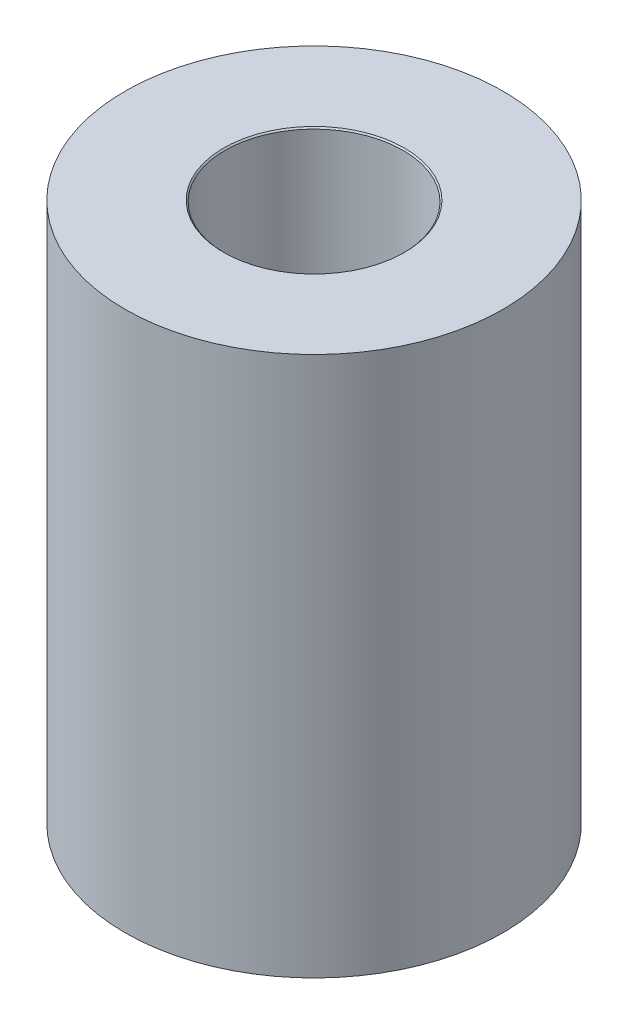
ISO-10303-21;
HEADER;
FILE_DESCRIPTION(('STEP AP214'),'2;1');
FILE_NAME('part.step','',(''),(''),'','','');
FILE_SCHEMA(('AUTOMOTIVE_DESIGN { 1 0 10303 214 1 1 1 1 }'));
ENDSEC;
DATA;
#1=APPLICATION_CONTEXT('core data for automotive mechanical design processes');
#2=APPLICATION_PROTOCOL_DEFINITION('international standard','automotive_design',2000,#1);
#3=PRODUCT_CONTEXT('',#1,'mechanical');
#4=PRODUCT('Part','Part','',(#3));
#5=PRODUCT_RELATED_PRODUCT_CATEGORY('part','',(#4));
#6=PRODUCT_DEFINITION_FORMATION('','',#4);
#7=PRODUCT_DEFINITION_CONTEXT('part definition',#1,'design');
#8=PRODUCT_DEFINITION('design','',#6,#7);
#9=PRODUCT_DEFINITION_SHAPE('','',#8);
#10=(LENGTH_UNIT() NAMED_UNIT(*) SI_UNIT(.MILLI.,.METRE.));
#11=(NAMED_UNIT(*) PLANE_ANGLE_UNIT() SI_UNIT($,.RADIAN.));
#12=(NAMED_UNIT(*) SI_UNIT($,.STERADIAN.) SOLID_ANGLE_UNIT());
#13=UNCERTAINTY_MEASURE_WITH_UNIT(LENGTH_MEASURE(1.E-05),#10,'distance_accuracy_value','');
#14=(GEOMETRIC_REPRESENTATION_CONTEXT(3) GLOBAL_UNCERTAINTY_ASSIGNED_CONTEXT((#13)) GLOBAL_UNIT_ASSIGNED_CONTEXT((#10,
#11,#12)) REPRESENTATION_CONTEXT('',''));
#15=CARTESIAN_POINT('',(0.,0.,0.));
#16=DIRECTION('',(0.,0.,1.));
#17=DIRECTION('',(1.,0.,0.));
#18=AXIS2_PLACEMENT_3D('',#15,#16,#17);
#19=CARTESIAN_POINT('',(0.,10.,0.));
#20=DIRECTION('',(0.,-1.,0.));
#21=DIRECTION('',(0.,0.,-1.));
#22=AXIS2_PLACEMENT_3D('',#19,#20,#21);
#23=CYLINDRICAL_SURFACE('',#22,3.5);
#24=CARTESIAN_POINT('',(0.,10.,0.));
#25=DIRECTION('',(0.,1.,0.));
#26=DIRECTION('',(0.,0.,1.));
#27=AXIS2_PLACEMENT_3D('',#24,#25,#26);
#28=CIRCLE('',#27,3.5);
#29=CARTESIAN_POINT('',(0.,10.,3.5));
#30=VERTEX_POINT('',#29);
#31=EDGE_CURVE('E10',#30,#30,#28,.T.);
#32=ORIENTED_EDGE('',*,*,#31,.F.);
#33=EDGE_LOOP('',(#32));
#34=FACE_BOUND('',#33,.T.);
#35=CARTESIAN_POINT('',(0.,0.,0.));
#36=DIRECTION('',(0.,1.,0.));
#37=DIRECTION('',(0.,0.,1.));
#38=AXIS2_PLACEMENT_3D('',#35,#36,#37);
#39=CIRCLE('',#38,3.5);
#40=CARTESIAN_POINT('',(0.,0.,3.5));
#41=VERTEX_POINT('',#40);
#42=EDGE_CURVE('E45',#41,#41,#39,.T.);
#43=ORIENTED_EDGE('',*,*,#42,.T.);
#44=EDGE_LOOP('',(#43));
#45=FACE_BOUND('',#44,.T.);
#46=ADVANCED_FACE('F39',(#34,#45),#23,.T.);
#47=CARTESIAN_POINT('',(0.,10.,0.));
#48=DIRECTION('',(0.,1.,0.));
#49=DIRECTION('',(0.,0.,1.));
#50=AXIS2_PLACEMENT_3D('',#47,#48,#49);
#51=PLANE('',#50);
#52=CARTESIAN_POINT('',(0.,10.,0.));
#53=DIRECTION('',(0.,-1.,0.));
#54=DIRECTION('',(0.,0.,-1.));
#55=AXIS2_PLACEMENT_3D('',#52,#53,#54);
#56=CIRCLE('',#55,1.675);
#57=CARTESIAN_POINT('',(0.,10.,-1.675));
#58=VERTEX_POINT('',#57);
#59=EDGE_CURVE('E56',#58,#58,#56,.T.);
#60=ORIENTED_EDGE('',*,*,#59,.T.);
#61=EDGE_LOOP('',(#60));
#62=FACE_BOUND('',#61,.T.);
#63=ORIENTED_EDGE('',*,*,#31,.T.);
#64=EDGE_LOOP('',(#63));
#65=FACE_BOUND('',#64,.T.);
#66=ADVANCED_FACE('F61',(#62,#65),#51,.T.);
#67=CARTESIAN_POINT('',(0.,0.,0.));
#68=DIRECTION('',(0.,1.,0.));
#69=DIRECTION('',(0.,0.,1.));
#70=AXIS2_PLACEMENT_3D('',#67,#68,#69);
#71=PLANE('',#70);
#72=CARTESIAN_POINT('',(0.,0.,0.));
#73=DIRECTION('',(0.,-1.,0.));
#74=DIRECTION('',(0.,0.,-1.));
#75=AXIS2_PLACEMENT_3D('',#72,#73,#74);
#76=CIRCLE('',#75,1.75);
#77=CARTESIAN_POINT('',(0.,0.,-1.75));
#78=VERTEX_POINT('',#77);
#79=EDGE_CURVE('E57',#78,#78,#76,.T.);
#80=ORIENTED_EDGE('',*,*,#79,.F.);
#81=EDGE_LOOP('',(#80));
#82=FACE_BOUND('',#81,.T.);
#83=ORIENTED_EDGE('',*,*,#42,.F.);
#84=EDGE_LOOP('',(#83));
#85=FACE_BOUND('',#84,.T.);
#86=ADVANCED_FACE('F67',(#82,#85),#71,.F.);
#87=CARTESIAN_POINT('',(0.,9.975,0.));
#88=DIRECTION('',(0.,1.,0.));
#89=DIRECTION('',(0.,0.,1.));
#90=AXIS2_PLACEMENT_3D('',#87,#88,#89);
#91=CONICAL_SURFACE('',#90,1.65,0.785398163397435);
#92=ORIENTED_EDGE('',*,*,#59,.F.);
#93=EDGE_LOOP('',(#92));
#94=FACE_BOUND('',#93,.T.);
#95=CARTESIAN_POINT('',(0.,9.975,0.));
#96=DIRECTION('',(0.,-1.,0.));
#97=DIRECTION('',(0.,0.,-1.));
#98=AXIS2_PLACEMENT_3D('',#95,#96,#97);
#99=CIRCLE('',#98,1.65);
#100=CARTESIAN_POINT('',(0.,9.975,-1.65));
#101=VERTEX_POINT('',#100);
#102=EDGE_CURVE('E47',#101,#101,#99,.T.);
#103=ORIENTED_EDGE('',*,*,#102,.T.);
#104=EDGE_LOOP('',(#103));
#105=FACE_BOUND('',#104,.T.);
#106=ADVANCED_FACE('F64',(#94,#105),#91,.F.);
#107=CARTESIAN_POINT('',(0.,0.,0.));
#108=DIRECTION('',(0.,-1.,0.));
#109=DIRECTION('',(0.,0.,-1.));
#110=AXIS2_PLACEMENT_3D('',#107,#108,#109);
#111=CYLINDRICAL_SURFACE('',#110,1.65);
#112=ORIENTED_EDGE('',*,*,#102,.F.);
#113=EDGE_LOOP('',(#112));
#114=FACE_BOUND('',#113,.T.);
#115=CARTESIAN_POINT('',(0.,0.100000000000001,0.));
#116=DIRECTION('',(0.,-1.,0.));
#117=DIRECTION('',(0.,0.,-1.));
#118=AXIS2_PLACEMENT_3D('',#115,#116,#117);
#119=CIRCLE('',#118,1.65);
#120=CARTESIAN_POINT('',(0.,0.100000000000001,-1.65));
#121=VERTEX_POINT('',#120);
#122=EDGE_CURVE('E52',#121,#121,#119,.T.);
#123=ORIENTED_EDGE('',*,*,#122,.T.);
#124=EDGE_LOOP('',(#123));
#125=FACE_BOUND('',#124,.T.);
#126=ADVANCED_FACE('F68',(#114,#125),#111,.F.);
#127=CARTESIAN_POINT('',(0.,0.,0.));
#128=DIRECTION('',(0.,-1.,0.));
#129=DIRECTION('',(0.,0.,-1.));
#130=AXIS2_PLACEMENT_3D('',#127,#128,#129);
#131=CONICAL_SURFACE('',#130,1.75,0.785398163397449);
#132=ORIENTED_EDGE('',*,*,#122,.F.);
#133=EDGE_LOOP('',(#132));
#134=FACE_BOUND('',#133,.T.);
#135=ORIENTED_EDGE('',*,*,#79,.T.);
#136=EDGE_LOOP('',(#135));
#137=FACE_BOUND('',#136,.T.);
#138=ADVANCED_FACE('F73',(#134,#137),#131,.F.);
#139=CLOSED_SHELL('',(#46,#66,#86,#106,#126,#138));
#140=MANIFOLD_SOLID_BREP('B2',#139);
#141=ADVANCED_BREP_SHAPE_REPRESENTATION('',(#18,#140),#14);
#142=SHAPE_DEFINITION_REPRESENTATION(#9,#141);
ENDSEC;
END-ISO-10303-21;
